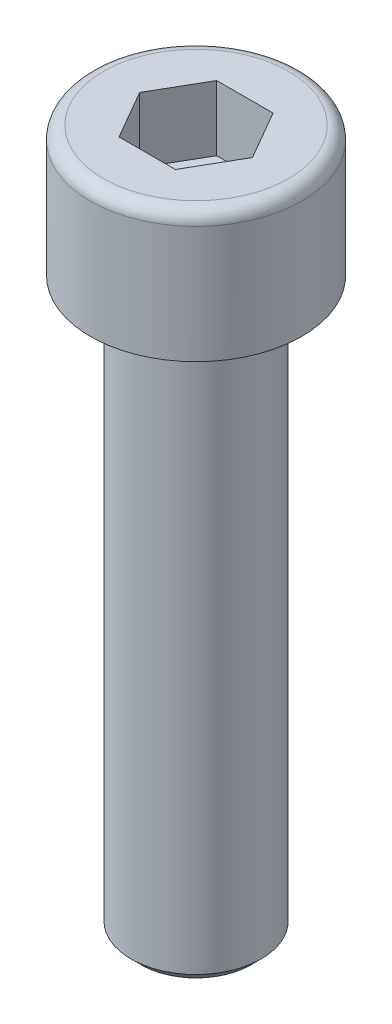
ISO-10303-21;
HEADER;
FILE_DESCRIPTION(('STEP AP214'),'2;1');
FILE_NAME('part.step','',(''),(''),'','','');
FILE_SCHEMA(('AUTOMOTIVE_DESIGN { 1 0 10303 214 1 1 1 1 }'));
ENDSEC;
DATA;
#1=APPLICATION_CONTEXT('core data for automotive mechanical design processes');
#2=APPLICATION_PROTOCOL_DEFINITION('international standard','automotive_design',2000,#1);
#3=PRODUCT_CONTEXT('',#1,'mechanical');
#4=PRODUCT('Part','Part','',(#3));
#5=PRODUCT_RELATED_PRODUCT_CATEGORY('part','',(#4));
#6=PRODUCT_DEFINITION_FORMATION('','',#4);
#7=PRODUCT_DEFINITION_CONTEXT('part definition',#1,'design');
#8=PRODUCT_DEFINITION('design','',#6,#7);
#9=PRODUCT_DEFINITION_SHAPE('','',#8);
#10=(LENGTH_UNIT() NAMED_UNIT(*) SI_UNIT(.MILLI.,.METRE.));
#11=(NAMED_UNIT(*) PLANE_ANGLE_UNIT() SI_UNIT($,.RADIAN.));
#12=(NAMED_UNIT(*) SI_UNIT($,.STERADIAN.) SOLID_ANGLE_UNIT());
#13=UNCERTAINTY_MEASURE_WITH_UNIT(LENGTH_MEASURE(1.E-05),#10,'distance_accuracy_value','');
#14=(GEOMETRIC_REPRESENTATION_CONTEXT(3) GLOBAL_UNCERTAINTY_ASSIGNED_CONTEXT((#13)) GLOBAL_UNIT_ASSIGNED_CONTEXT((#10,
#11,#12)) REPRESENTATION_CONTEXT('',''));
#15=CARTESIAN_POINT('',(0.,0.,0.));
#16=DIRECTION('',(0.,0.,1.));
#17=DIRECTION('',(1.,0.,0.));
#18=AXIS2_PLACEMENT_3D('',#15,#16,#17);
#19=CARTESIAN_POINT('',(0.,0.,0.));
#20=DIRECTION('',(0.,1.,0.));
#21=DIRECTION('',(0.,0.,1.));
#22=AXIS2_PLACEMENT_3D('',#19,#20,#21);
#23=PLANE('',#22);
#24=CARTESIAN_POINT('',(0.,0.,0.));
#25=DIRECTION('',(0.,1.,0.));
#26=DIRECTION('',(0.,0.,1.));
#27=AXIS2_PLACEMENT_3D('',#24,#25,#26);
#28=CIRCLE('',#27,5.7);
#29=CARTESIAN_POINT('',(0.,0.,5.7));
#30=VERTEX_POINT('',#29);
#31=EDGE_CURVE('E166',#30,#30,#28,.T.);
#32=ORIENTED_EDGE('',*,*,#31,.T.);
#33=EDGE_LOOP('',(#32));
#34=FACE_BOUND('',#33,.T.);
#35=DIRECTION('',(0.5,0.,-0.866025403784439));
#36=VECTOR('',#35,1.);
#37=CARTESIAN_POINT('',(1.73205080756888,0.,3.));
#38=LINE('',#37,#36);
#39=CARTESIAN_POINT('',(1.73205080756888,0.,3.));
#40=VERTEX_POINT('',#39);
#41=CARTESIAN_POINT('',(3.46410161513775,0.,0.));
#42=VERTEX_POINT('',#41);
#43=EDGE_CURVE('E65',#40,#42,#38,.T.);
#44=ORIENTED_EDGE('',*,*,#43,.F.);
#45=DIRECTION('',(1.,0.,0.));
#46=VECTOR('',#45,1.);
#47=CARTESIAN_POINT('',(-1.73205080756888,0.,3.));
#48=LINE('',#47,#46);
#49=CARTESIAN_POINT('',(-1.73205080756888,0.,3.));
#50=VERTEX_POINT('',#49);
#51=EDGE_CURVE('E148',#50,#40,#48,.T.);
#52=ORIENTED_EDGE('',*,*,#51,.F.);
#53=DIRECTION('',(0.5,0.,0.866025403784439));
#54=VECTOR('',#53,1.);
#55=CARTESIAN_POINT('',(-3.46410161513775,0.,0.));
#56=LINE('',#55,#54);
#57=CARTESIAN_POINT('',(-3.46410161513775,0.,0.));
#58=VERTEX_POINT('',#57);
#59=EDGE_CURVE('E146',#58,#50,#56,.T.);
#60=ORIENTED_EDGE('',*,*,#59,.F.);
#61=DIRECTION('',(-0.5,0.,0.866025403784439));
#62=VECTOR('',#61,1.);
#63=CARTESIAN_POINT('',(-1.73205080756888,0.,-3.));
#64=LINE('',#63,#62);
#65=CARTESIAN_POINT('',(-1.73205080756888,0.,-3.));
#66=VERTEX_POINT('',#65);
#67=EDGE_CURVE('E113',#66,#58,#64,.T.);
#68=ORIENTED_EDGE('',*,*,#67,.F.);
#69=DIRECTION('',(-1.,0.,0.));
#70=VECTOR('',#69,1.);
#71=CARTESIAN_POINT('',(1.73205080756888,0.,-3.));
#72=LINE('',#71,#70);
#73=CARTESIAN_POINT('',(1.73205080756888,0.,-3.));
#74=VERTEX_POINT('',#73);
#75=EDGE_CURVE('E142',#74,#66,#72,.T.);
#76=ORIENTED_EDGE('',*,*,#75,.F.);
#77=DIRECTION('',(-0.5,0.,-0.866025403784438));
#78=VECTOR('',#77,1.);
#79=CARTESIAN_POINT('',(3.46410161513775,0.,0.));
#80=LINE('',#79,#78);
#81=EDGE_CURVE('E139',#42,#74,#80,.T.);
#82=ORIENTED_EDGE('',*,*,#81,.F.);
#83=EDGE_LOOP('',(#44,#52,#60,#68,#76,#82));
#84=FACE_BOUND('',#83,.T.);
#85=ADVANCED_FACE('F49',(#34,#84),#23,.T.);
#86=CARTESIAN_POINT('',(0.,-48.,0.));
#87=DIRECTION('',(0.,-1.,0.));
#88=DIRECTION('',(0.,0.,-1.));
#89=AXIS2_PLACEMENT_3D('',#86,#87,#88);
#90=CYLINDRICAL_SURFACE('',#89,6.5);
#91=CARTESIAN_POINT('',(0.,-0.800000000000002,0.));
#92=DIRECTION('',(0.,1.,0.));
#93=DIRECTION('',(0.,0.,1.));
#94=AXIS2_PLACEMENT_3D('',#91,#92,#93);
#95=CIRCLE('',#94,6.5);
#96=CARTESIAN_POINT('',(0.,-0.800000000000002,6.5));
#97=VERTEX_POINT('',#96);
#98=EDGE_CURVE('E163',#97,#97,#95,.F.);
#99=ORIENTED_EDGE('',*,*,#98,.T.);
#100=EDGE_LOOP('',(#99));
#101=FACE_BOUND('',#100,.T.);
#102=CARTESIAN_POINT('',(0.,-8.,0.));
#103=DIRECTION('',(0.,-1.,0.));
#104=DIRECTION('',(0.,0.,-1.));
#105=AXIS2_PLACEMENT_3D('',#102,#103,#104);
#106=CIRCLE('',#105,6.5);
#107=CARTESIAN_POINT('',(0.,-8.,-6.5));
#108=VERTEX_POINT('',#107);
#109=EDGE_CURVE('E160',#108,#108,#106,.T.);
#110=ORIENTED_EDGE('',*,*,#109,.F.);
#111=EDGE_LOOP('',(#110));
#112=FACE_BOUND('',#111,.T.);
#113=ADVANCED_FACE('F184',(#101,#112),#90,.T.);
#114=CARTESIAN_POINT('',(6.5,-8.,0.));
#115=DIRECTION('',(0.,-1.,0.));
#116=DIRECTION('',(0.,0.,-1.));
#117=AXIS2_PLACEMENT_3D('',#114,#115,#116);
#118=PLANE('',#117);
#119=ORIENTED_EDGE('',*,*,#109,.T.);
#120=EDGE_LOOP('',(#119));
#121=FACE_BOUND('',#120,.T.);
#122=CARTESIAN_POINT('',(0.,-8.,0.));
#123=DIRECTION('',(0.,-1.,0.));
#124=DIRECTION('',(0.,0.,-1.));
#125=AXIS2_PLACEMENT_3D('',#122,#123,#124);
#126=CIRCLE('',#125,4.);
#127=CARTESIAN_POINT('',(0.,-8.,-4.));
#128=VERTEX_POINT('',#127);
#129=EDGE_CURVE('E152',#128,#128,#126,.T.);
#130=ORIENTED_EDGE('',*,*,#129,.F.);
#131=EDGE_LOOP('',(#130));
#132=FACE_BOUND('',#131,.T.);
#133=ADVANCED_FACE('F191',(#121,#132),#118,.T.);
#134=CARTESIAN_POINT('',(0.,-48.,0.));
#135=DIRECTION('',(0.,-1.,0.));
#136=DIRECTION('',(0.,0.,-1.));
#137=AXIS2_PLACEMENT_3D('',#134,#135,#136);
#138=CYLINDRICAL_SURFACE('',#137,4.);
#139=CARTESIAN_POINT('',(0.,-42.375,0.));
#140=DIRECTION('',(0.,-1.,0.));
#141=DIRECTION('',(0.,0.,-1.));
#142=AXIS2_PLACEMENT_3D('',#139,#140,#141);
#143=CIRCLE('',#142,4.);
#144=CARTESIAN_POINT('',(0.,-42.375,-4.));
#145=VERTEX_POINT('',#144);
#146=EDGE_CURVE('E11',#145,#145,#143,.F.);
#147=ORIENTED_EDGE('',*,*,#146,.T.);
#148=EDGE_LOOP('',(#147));
#149=FACE_BOUND('',#148,.T.);
#150=ORIENTED_EDGE('',*,*,#129,.T.);
#151=EDGE_LOOP('',(#150));
#152=FACE_BOUND('',#151,.T.);
#153=ADVANCED_FACE('F198',(#149,#152),#138,.T.);
#154=CARTESIAN_POINT('',(4.,-43.,0.));
#155=DIRECTION('',(0.,-1.,0.));
#156=DIRECTION('',(0.,0.,-1.));
#157=AXIS2_PLACEMENT_3D('',#154,#155,#156);
#158=PLANE('',#157);
#159=CARTESIAN_POINT('',(0.,-43.,0.));
#160=DIRECTION('',(0.,-1.,0.));
#161=DIRECTION('',(0.,0.,-1.));
#162=AXIS2_PLACEMENT_3D('',#159,#160,#161);
#163=CIRCLE('',#162,3.375);
#164=CARTESIAN_POINT('',(0.,-43.,-3.375));
#165=VERTEX_POINT('',#164);
#166=EDGE_CURVE('E58',#165,#165,#163,.T.);
#167=ORIENTED_EDGE('',*,*,#166,.T.);
#168=EDGE_LOOP('',(#167));
#169=FACE_BOUND('',#168,.T.);
#170=ADVANCED_FACE('F171',(#169),#158,.T.);
#171=CARTESIAN_POINT('',(1.73205080756888,-4.,3.));
#172=DIRECTION('',(0.866025403784439,0.,0.5));
#173=DIRECTION('',(0.5,0.,-0.866025403784439));
#174=AXIS2_PLACEMENT_3D('',#171,#172,#173);
#175=PLANE('',#174);
#176=ORIENTED_EDGE('',*,*,#43,.T.);
#177=DIRECTION('',(0.,1.,0.));
#178=VECTOR('',#177,1.);
#179=CARTESIAN_POINT('',(3.46410161513775,-4.,0.));
#180=LINE('',#179,#178);
#181=CARTESIAN_POINT('',(3.46410161513775,-4.,0.));
#182=VERTEX_POINT('',#181);
#183=EDGE_CURVE('E95',#182,#42,#180,.T.);
#184=ORIENTED_EDGE('',*,*,#183,.F.);
#185=DIRECTION('',(0.5,0.,-0.866025403784439));
#186=VECTOR('',#185,1.);
#187=CARTESIAN_POINT('',(1.73205080756888,-4.,3.));
#188=LINE('',#187,#186);
#189=CARTESIAN_POINT('',(1.73205080756888,-4.,3.));
#190=VERTEX_POINT('',#189);
#191=EDGE_CURVE('E150',#190,#182,#188,.T.);
#192=ORIENTED_EDGE('',*,*,#191,.F.);
#193=DIRECTION('',(0.,1.,0.));
#194=VECTOR('',#193,1.);
#195=CARTESIAN_POINT('',(1.73205080756888,-4.,3.));
#196=LINE('',#195,#194);
#197=EDGE_CURVE('E73',#190,#40,#196,.T.);
#198=ORIENTED_EDGE('',*,*,#197,.T.);
#199=EDGE_LOOP('',(#176,#184,#192,#198));
#200=FACE_BOUND('',#199,.T.);
#201=ADVANCED_FACE('F204',(#200),#175,.F.);
#202=CARTESIAN_POINT('',(-1.73205080756888,-4.,3.));
#203=DIRECTION('',(0.,0.,1.));
#204=DIRECTION('',(1.,0.,0.));
#205=AXIS2_PLACEMENT_3D('',#202,#203,#204);
#206=PLANE('',#205);
#207=ORIENTED_EDGE('',*,*,#51,.T.);
#208=ORIENTED_EDGE('',*,*,#197,.F.);
#209=DIRECTION('',(1.,0.,0.));
#210=VECTOR('',#209,1.);
#211=CARTESIAN_POINT('',(-1.73205080756888,-4.,3.));
#212=LINE('',#211,#210);
#213=CARTESIAN_POINT('',(-1.73205080756888,-4.,3.));
#214=VERTEX_POINT('',#213);
#215=EDGE_CURVE('E125',#214,#190,#212,.T.);
#216=ORIENTED_EDGE('',*,*,#215,.F.);
#217=DIRECTION('',(0.,1.,0.));
#218=VECTOR('',#217,1.);
#219=CARTESIAN_POINT('',(-1.73205080756888,-4.,3.));
#220=LINE('',#219,#218);
#221=EDGE_CURVE('E117',#214,#50,#220,.T.);
#222=ORIENTED_EDGE('',*,*,#221,.T.);
#223=EDGE_LOOP('',(#207,#208,#216,#222));
#224=FACE_BOUND('',#223,.T.);
#225=ADVANCED_FACE('F207',(#224),#206,.F.);
#226=CARTESIAN_POINT('',(-3.46410161513775,-4.,0.));
#227=DIRECTION('',(-0.866025403784439,0.,0.5));
#228=DIRECTION('',(0.5,0.,0.866025403784439));
#229=AXIS2_PLACEMENT_3D('',#226,#227,#228);
#230=PLANE('',#229);
#231=ORIENTED_EDGE('',*,*,#59,.T.);
#232=ORIENTED_EDGE('',*,*,#221,.F.);
#233=DIRECTION('',(0.5,0.,0.866025403784439));
#234=VECTOR('',#233,1.);
#235=CARTESIAN_POINT('',(-3.46410161513775,-4.,0.));
#236=LINE('',#235,#234);
#237=CARTESIAN_POINT('',(-3.46410161513775,-4.,0.));
#238=VERTEX_POINT('',#237);
#239=EDGE_CURVE('E121',#238,#214,#236,.T.);
#240=ORIENTED_EDGE('',*,*,#239,.F.);
#241=DIRECTION('',(0.,1.,0.));
#242=VECTOR('',#241,1.);
#243=CARTESIAN_POINT('',(-3.46410161513775,-4.,0.));
#244=LINE('',#243,#242);
#245=EDGE_CURVE('E106',#238,#58,#244,.T.);
#246=ORIENTED_EDGE('',*,*,#245,.T.);
#247=EDGE_LOOP('',(#231,#232,#240,#246));
#248=FACE_BOUND('',#247,.T.);
#249=ADVANCED_FACE('F122',(#248),#230,.F.);
#250=CARTESIAN_POINT('',(-1.73205080756888,-4.,-3.));
#251=DIRECTION('',(-0.866025403784439,0.,-0.5));
#252=DIRECTION('',(-0.5,0.,0.866025403784439));
#253=AXIS2_PLACEMENT_3D('',#250,#251,#252);
#254=PLANE('',#253);
#255=ORIENTED_EDGE('',*,*,#67,.T.);
#256=ORIENTED_EDGE('',*,*,#245,.F.);
#257=DIRECTION('',(-0.5,0.,0.866025403784439));
#258=VECTOR('',#257,1.);
#259=CARTESIAN_POINT('',(-1.73205080756888,-4.,-3.));
#260=LINE('',#259,#258);
#261=CARTESIAN_POINT('',(-1.73205080756888,-4.,-3.));
#262=VERTEX_POINT('',#261);
#263=EDGE_CURVE('E110',#262,#238,#260,.T.);
#264=ORIENTED_EDGE('',*,*,#263,.F.);
#265=DIRECTION('',(0.,1.,0.));
#266=VECTOR('',#265,1.);
#267=CARTESIAN_POINT('',(-1.73205080756888,-4.,-3.));
#268=LINE('',#267,#266);
#269=EDGE_CURVE('E118',#262,#66,#268,.T.);
#270=ORIENTED_EDGE('',*,*,#269,.T.);
#271=EDGE_LOOP('',(#255,#256,#264,#270));
#272=FACE_BOUND('',#271,.T.);
#273=ADVANCED_FACE('F108',(#272),#254,.F.);
#274=CARTESIAN_POINT('',(1.73205080756888,-4.,-3.));
#275=DIRECTION('',(0.,0.,-1.));
#276=DIRECTION('',(-1.,0.,0.));
#277=AXIS2_PLACEMENT_3D('',#274,#275,#276);
#278=PLANE('',#277);
#279=ORIENTED_EDGE('',*,*,#75,.T.);
#280=ORIENTED_EDGE('',*,*,#269,.F.);
#281=DIRECTION('',(-1.,0.,0.));
#282=VECTOR('',#281,1.);
#283=CARTESIAN_POINT('',(1.73205080756888,-4.,-3.));
#284=LINE('',#283,#282);
#285=CARTESIAN_POINT('',(1.73205080756888,-4.,-3.));
#286=VERTEX_POINT('',#285);
#287=EDGE_CURVE('E131',#286,#262,#284,.T.);
#288=ORIENTED_EDGE('',*,*,#287,.F.);
#289=DIRECTION('',(0.,1.,0.));
#290=VECTOR('',#289,1.);
#291=CARTESIAN_POINT('',(1.73205080756888,-4.,-3.));
#292=LINE('',#291,#290);
#293=EDGE_CURVE('E155',#286,#74,#292,.T.);
#294=ORIENTED_EDGE('',*,*,#293,.T.);
#295=EDGE_LOOP('',(#279,#280,#288,#294));
#296=FACE_BOUND('',#295,.T.);
#297=ADVANCED_FACE('F211',(#296),#278,.F.);
#298=CARTESIAN_POINT('',(3.46410161513775,-4.,0.));
#299=DIRECTION('',(0.866025403784439,0.,-0.5));
#300=DIRECTION('',(-0.5,0.,-0.866025403784439));
#301=AXIS2_PLACEMENT_3D('',#298,#299,#300);
#302=PLANE('',#301);
#303=ORIENTED_EDGE('',*,*,#81,.T.);
#304=ORIENTED_EDGE('',*,*,#293,.F.);
#305=DIRECTION('',(-0.5,0.,-0.866025403784438));
#306=VECTOR('',#305,1.);
#307=CARTESIAN_POINT('',(3.46410161513775,-4.,0.));
#308=LINE('',#307,#306);
#309=EDGE_CURVE('E133',#182,#286,#308,.T.);
#310=ORIENTED_EDGE('',*,*,#309,.F.);
#311=ORIENTED_EDGE('',*,*,#183,.T.);
#312=EDGE_LOOP('',(#303,#304,#310,#311));
#313=FACE_BOUND('',#312,.T.);
#314=ADVANCED_FACE('F208',(#313),#302,.F.);
#315=CARTESIAN_POINT('',(0.,-4.,0.));
#316=DIRECTION('',(0.,1.,0.));
#317=DIRECTION('',(0.,0.,1.));
#318=AXIS2_PLACEMENT_3D('',#315,#316,#317);
#319=PLANE('',#318);
#320=ORIENTED_EDGE('',*,*,#191,.T.);
#321=ORIENTED_EDGE('',*,*,#309,.T.);
#322=ORIENTED_EDGE('',*,*,#287,.T.);
#323=ORIENTED_EDGE('',*,*,#263,.T.);
#324=ORIENTED_EDGE('',*,*,#239,.T.);
#325=ORIENTED_EDGE('',*,*,#215,.T.);
#326=EDGE_LOOP('',(#320,#321,#322,#323,#324,#325));
#327=FACE_BOUND('',#326,.T.);
#328=ADVANCED_FACE('F128',(#327),#319,.T.);
#329=CARTESIAN_POINT('',(0.,-0.800000000000002,0.));
#330=DIRECTION('',(0.,1.,0.));
#331=DIRECTION('',(0.,0.,1.));
#332=AXIS2_PLACEMENT_3D('',#329,#330,#331);
#333=TOROIDAL_SURFACE('',#332,5.7,0.8);
#334=ORIENTED_EDGE('',*,*,#31,.F.);
#335=EDGE_LOOP('',(#334));
#336=FACE_BOUND('',#335,.T.);
#337=ORIENTED_EDGE('',*,*,#98,.F.);
#338=EDGE_LOOP('',(#337));
#339=FACE_BOUND('',#338,.T.);
#340=ADVANCED_FACE('F174',(#336,#339),#333,.T.);
#341=CARTESIAN_POINT('',(0.,-43.,0.));
#342=DIRECTION('',(0.,1.,0.));
#343=DIRECTION('',(0.,0.,1.));
#344=AXIS2_PLACEMENT_3D('',#341,#342,#343);
#345=CONICAL_SURFACE('',#344,3.375,0.785398163397448);
#346=ORIENTED_EDGE('',*,*,#146,.F.);
#347=EDGE_LOOP('',(#346));
#348=FACE_BOUND('',#347,.T.);
#349=ORIENTED_EDGE('',*,*,#166,.F.);
#350=EDGE_LOOP('',(#349));
#351=FACE_BOUND('',#350,.T.);
#352=ADVANCED_FACE('F52',(#348,#351),#345,.T.);
#353=CLOSED_SHELL('',(#85,#113,#133,#153,#170,#201,#225,#249,#273,#297,#314,#328,#340,#352));
#354=MANIFOLD_SOLID_BREP('B2',#353);
#355=ADVANCED_BREP_SHAPE_REPRESENTATION('',(#18,#354),#14);
#356=SHAPE_DEFINITION_REPRESENTATION(#9,#355);
ENDSEC;
END-ISO-10303-21;
